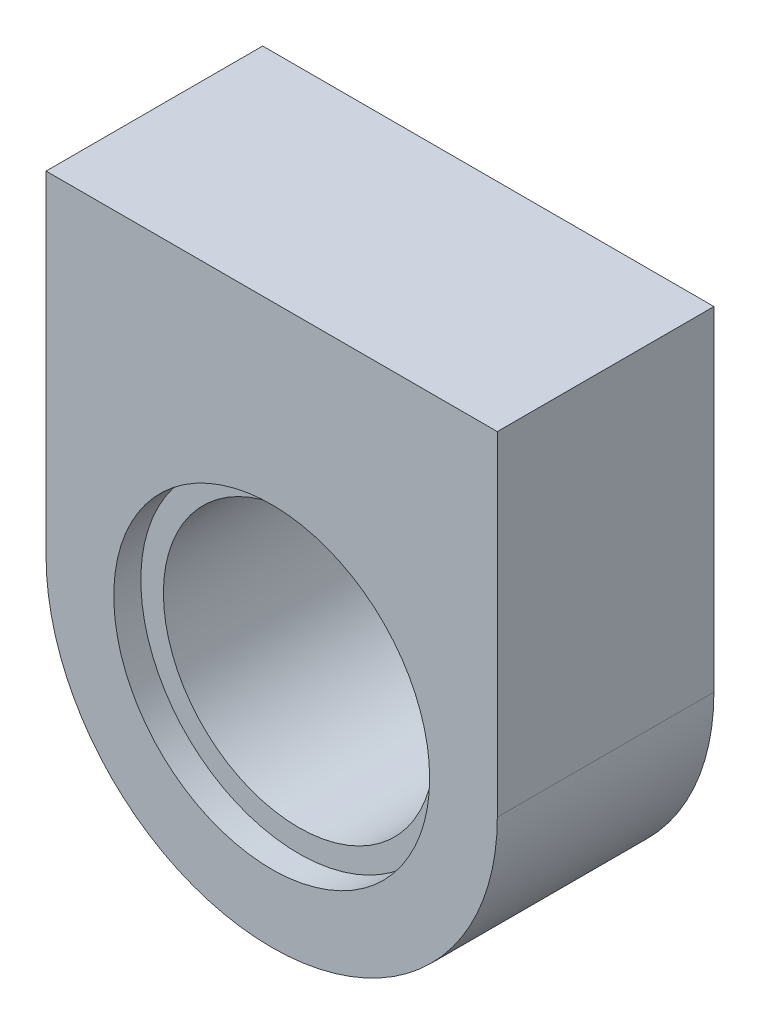
ISO-10303-21;
HEADER;
FILE_DESCRIPTION(('STEP AP214'),'2;1');
FILE_NAME('part.step','',(''),(''),'','','');
FILE_SCHEMA(('AUTOMOTIVE_DESIGN { 1 0 10303 214 1 1 1 1 }'));
ENDSEC;
DATA;
#1=APPLICATION_CONTEXT('core data for automotive mechanical design processes');
#2=APPLICATION_PROTOCOL_DEFINITION('international standard','automotive_design',2000,#1);
#3=PRODUCT_CONTEXT('',#1,'mechanical');
#4=PRODUCT('Part','Part','',(#3));
#5=PRODUCT_RELATED_PRODUCT_CATEGORY('part','',(#4));
#6=PRODUCT_DEFINITION_FORMATION('','',#4);
#7=PRODUCT_DEFINITION_CONTEXT('part definition',#1,'design');
#8=PRODUCT_DEFINITION('design','',#6,#7);
#9=PRODUCT_DEFINITION_SHAPE('','',#8);
#10=(LENGTH_UNIT() NAMED_UNIT(*) SI_UNIT(.MILLI.,.METRE.));
#11=(NAMED_UNIT(*) PLANE_ANGLE_UNIT() SI_UNIT($,.RADIAN.));
#12=(NAMED_UNIT(*) SI_UNIT($,.STERADIAN.) SOLID_ANGLE_UNIT());
#13=UNCERTAINTY_MEASURE_WITH_UNIT(LENGTH_MEASURE(1.E-05),#10,'distance_accuracy_value','');
#14=(GEOMETRIC_REPRESENTATION_CONTEXT(3) GLOBAL_UNCERTAINTY_ASSIGNED_CONTEXT((#13)) GLOBAL_UNIT_ASSIGNED_CONTEXT((#10,
#11,#12)) REPRESENTATION_CONTEXT('',''));
#15=CARTESIAN_POINT('',(0.,0.,0.));
#16=DIRECTION('',(0.,0.,1.));
#17=DIRECTION('',(1.,0.,0.));
#18=AXIS2_PLACEMENT_3D('',#15,#16,#17);
#19=CARTESIAN_POINT('',(25.,-37.,30.));
#20=DIRECTION('',(0.,0.,-1.));
#21=DIRECTION('',(-1.,0.,0.));
#22=AXIS2_PLACEMENT_3D('',#19,#20,#21);
#23=CYLINDRICAL_SURFACE('',#22,15.);
#24=CARTESIAN_POINT('',(25.,-37.,0.));
#25=DIRECTION('',(0.,0.,-1.));
#26=DIRECTION('',(-1.,0.,0.));
#27=AXIS2_PLACEMENT_3D('',#24,#25,#26);
#28=CIRCLE('',#27,15.);
#29=CARTESIAN_POINT('',(10.,-37.,0.));
#30=VERTEX_POINT('',#29);
#31=EDGE_CURVE('E114',#30,#30,#28,.T.);
#32=ORIENTED_EDGE('',*,*,#31,.T.);
#33=EDGE_LOOP('',(#32));
#34=FACE_BOUND('',#33,.T.);
#35=CARTESIAN_POINT('',(25.,-37.,21.));
#36=DIRECTION('',(0.,0.,1.));
#37=DIRECTION('',(1.,0.,0.));
#38=AXIS2_PLACEMENT_3D('',#35,#36,#37);
#39=CIRCLE('',#38,15.);
#40=CARTESIAN_POINT('',(40.,-37.,21.));
#41=VERTEX_POINT('',#40);
#42=EDGE_CURVE('E34',#41,#41,#39,.F.);
#43=ORIENTED_EDGE('',*,*,#42,.F.);
#44=EDGE_LOOP('',(#43));
#45=FACE_BOUND('',#44,.T.);
#46=ADVANCED_FACE('F30',(#34,#45),#23,.F.);
#47=CARTESIAN_POINT('',(0.,0.,24.));
#48=DIRECTION('',(1.,0.,0.));
#49=DIRECTION('',(0.,1.,0.));
#50=AXIS2_PLACEMENT_3D('',#47,#48,#49);
#51=PLANE('',#50);
#52=DIRECTION('',(0.,-1.,0.));
#53=VECTOR('',#52,1.);
#54=CARTESIAN_POINT('',(0.,0.,0.));
#55=LINE('',#54,#53);
#56=CARTESIAN_POINT('',(0.,0.,0.));
#57=VERTEX_POINT('',#56);
#58=CARTESIAN_POINT('',(0.,-37.,0.));
#59=VERTEX_POINT('',#58);
#60=EDGE_CURVE('E99',#57,#59,#55,.T.);
#61=ORIENTED_EDGE('',*,*,#60,.T.);
#62=DIRECTION('',(0.,0.,-1.));
#63=VECTOR('',#62,1.);
#64=CARTESIAN_POINT('',(0.,-37.,24.));
#65=LINE('',#64,#63);
#66=CARTESIAN_POINT('',(0.,-37.,24.));
#67=VERTEX_POINT('',#66);
#68=EDGE_CURVE('E109',#59,#67,#65,.F.);
#69=ORIENTED_EDGE('',*,*,#68,.T.);
#70=DIRECTION('',(0.,-1.,0.));
#71=VECTOR('',#70,1.);
#72=CARTESIAN_POINT('',(0.,0.,24.));
#73=LINE('',#72,#71);
#74=CARTESIAN_POINT('',(0.,0.,24.));
#75=VERTEX_POINT('',#74);
#76=EDGE_CURVE('E80',#75,#67,#73,.T.);
#77=ORIENTED_EDGE('',*,*,#76,.F.);
#78=DIRECTION('',(0.,0.,-1.));
#79=VECTOR('',#78,1.);
#80=CARTESIAN_POINT('',(0.,0.,24.));
#81=LINE('',#80,#79);
#82=EDGE_CURVE('E90',#75,#57,#81,.T.);
#83=ORIENTED_EDGE('',*,*,#82,.T.);
#84=EDGE_LOOP('',(#61,#69,#77,#83));
#85=FACE_BOUND('',#84,.T.);
#86=ADVANCED_FACE('F128',(#85),#51,.F.);
#87=CARTESIAN_POINT('',(50.,0.,24.));
#88=DIRECTION('',(-1.,0.,0.));
#89=DIRECTION('',(0.,-1.,0.));
#90=AXIS2_PLACEMENT_3D('',#87,#88,#89);
#91=PLANE('',#90);
#92=DIRECTION('',(0.,1.,0.));
#93=VECTOR('',#92,1.);
#94=CARTESIAN_POINT('',(50.,0.,24.));
#95=LINE('',#94,#93);
#96=CARTESIAN_POINT('',(50.,-37.,24.));
#97=VERTEX_POINT('',#96);
#98=CARTESIAN_POINT('',(50.,0.,24.));
#99=VERTEX_POINT('',#98);
#100=EDGE_CURVE('E72',#97,#99,#95,.T.);
#101=ORIENTED_EDGE('',*,*,#100,.F.);
#102=DIRECTION('',(0.,0.,-1.));
#103=VECTOR('',#102,1.);
#104=CARTESIAN_POINT('',(50.,-37.,24.));
#105=LINE('',#104,#103);
#106=CARTESIAN_POINT('',(50.,-37.,0.));
#107=VERTEX_POINT('',#106);
#108=EDGE_CURVE('E11',#97,#107,#105,.T.);
#109=ORIENTED_EDGE('',*,*,#108,.T.);
#110=DIRECTION('',(0.,1.,0.));
#111=VECTOR('',#110,1.);
#112=CARTESIAN_POINT('',(50.,0.,0.));
#113=LINE('',#112,#111);
#114=CARTESIAN_POINT('',(50.,0.,0.));
#115=VERTEX_POINT('',#114);
#116=EDGE_CURVE('E86',#107,#115,#113,.T.);
#117=ORIENTED_EDGE('',*,*,#116,.T.);
#118=DIRECTION('',(0.,0.,-1.));
#119=VECTOR('',#118,1.);
#120=CARTESIAN_POINT('',(50.,0.,24.));
#121=LINE('',#120,#119);
#122=EDGE_CURVE('E83',#99,#115,#121,.T.);
#123=ORIENTED_EDGE('',*,*,#122,.F.);
#124=EDGE_LOOP('',(#101,#109,#117,#123));
#125=FACE_BOUND('',#124,.T.);
#126=ADVANCED_FACE('F84',(#125),#91,.F.);
#127=CARTESIAN_POINT('',(0.,0.,24.));
#128=DIRECTION('',(0.,-1.,0.));
#129=DIRECTION('',(0.,0.,-1.));
#130=AXIS2_PLACEMENT_3D('',#127,#128,#129);
#131=PLANE('',#130);
#132=DIRECTION('',(-1.,0.,0.));
#133=VECTOR('',#132,1.);
#134=CARTESIAN_POINT('',(0.,0.,0.));
#135=LINE('',#134,#133);
#136=EDGE_CURVE('E104',#115,#57,#135,.T.);
#137=ORIENTED_EDGE('',*,*,#136,.T.);
#138=ORIENTED_EDGE('',*,*,#82,.F.);
#139=DIRECTION('',(-1.,0.,0.));
#140=VECTOR('',#139,1.);
#141=CARTESIAN_POINT('',(0.,0.,24.));
#142=LINE('',#141,#140);
#143=EDGE_CURVE('E76',#99,#75,#142,.T.);
#144=ORIENTED_EDGE('',*,*,#143,.F.);
#145=ORIENTED_EDGE('',*,*,#122,.T.);
#146=EDGE_LOOP('',(#137,#138,#144,#145));
#147=FACE_BOUND('',#146,.T.);
#148=ADVANCED_FACE('F92',(#147),#131,.F.);
#149=CARTESIAN_POINT('',(0.,-62.,24.));
#150=DIRECTION('',(0.,0.,1.));
#151=DIRECTION('',(1.,0.,0.));
#152=AXIS2_PLACEMENT_3D('',#149,#150,#151);
#153=PLANE('',#152);
#154=CARTESIAN_POINT('',(25.,-37.,24.));
#155=DIRECTION('',(0.,0.,1.));
#156=DIRECTION('',(1.,0.,0.));
#157=AXIS2_PLACEMENT_3D('',#154,#155,#156);
#158=CIRCLE('',#157,17.5);
#159=CARTESIAN_POINT('',(42.5,-37.,24.));
#160=VERTEX_POINT('',#159);
#161=EDGE_CURVE('E125',#160,#160,#158,.T.);
#162=ORIENTED_EDGE('',*,*,#161,.F.);
#163=EDGE_LOOP('',(#162));
#164=FACE_BOUND('',#163,.T.);
#165=ORIENTED_EDGE('',*,*,#76,.T.);
#166=CARTESIAN_POINT('',(25.,-37.,24.));
#167=DIRECTION('',(0.,0.,1.));
#168=DIRECTION('',(1.,0.,0.));
#169=AXIS2_PLACEMENT_3D('',#166,#167,#168);
#170=CIRCLE('',#169,25.);
#171=CARTESIAN_POINT('',(25.,-62.,24.));
#172=VERTEX_POINT('',#171);
#173=EDGE_CURVE('E39',#67,#172,#170,.T.);
#174=ORIENTED_EDGE('',*,*,#173,.T.);
#175=CARTESIAN_POINT('',(25.,-37.,24.));
#176=DIRECTION('',(0.,0.,1.));
#177=DIRECTION('',(1.,0.,0.));
#178=AXIS2_PLACEMENT_3D('',#175,#176,#177);
#179=CIRCLE('',#178,25.);
#180=EDGE_CURVE('E47',#172,#97,#179,.T.);
#181=ORIENTED_EDGE('',*,*,#180,.T.);
#182=ORIENTED_EDGE('',*,*,#100,.T.);
#183=ORIENTED_EDGE('',*,*,#143,.T.);
#184=EDGE_LOOP('',(#165,#174,#181,#182,#183));
#185=FACE_BOUND('',#184,.T.);
#186=ADVANCED_FACE('F74',(#164,#185),#153,.T.);
#187=CARTESIAN_POINT('',(0.,-62.,0.));
#188=DIRECTION('',(0.,0.,1.));
#189=DIRECTION('',(1.,0.,0.));
#190=AXIS2_PLACEMENT_3D('',#187,#188,#189);
#191=PLANE('',#190);
#192=ORIENTED_EDGE('',*,*,#31,.F.);
#193=EDGE_LOOP('',(#192));
#194=FACE_BOUND('',#193,.T.);
#195=CARTESIAN_POINT('',(25.,-37.,0.));
#196=DIRECTION('',(0.,0.,1.));
#197=DIRECTION('',(1.,0.,0.));
#198=AXIS2_PLACEMENT_3D('',#195,#196,#197);
#199=CIRCLE('',#198,25.);
#200=CARTESIAN_POINT('',(25.,-62.,0.));
#201=VERTEX_POINT('',#200);
#202=EDGE_CURVE('E89',#107,#201,#199,.F.);
#203=ORIENTED_EDGE('',*,*,#202,.T.);
#204=CARTESIAN_POINT('',(25.,-37.,0.));
#205=DIRECTION('',(0.,0.,1.));
#206=DIRECTION('',(1.,0.,0.));
#207=AXIS2_PLACEMENT_3D('',#204,#205,#206);
#208=CIRCLE('',#207,25.);
#209=EDGE_CURVE('E107',#201,#59,#208,.F.);
#210=ORIENTED_EDGE('',*,*,#209,.T.);
#211=ORIENTED_EDGE('',*,*,#60,.F.);
#212=ORIENTED_EDGE('',*,*,#136,.F.);
#213=ORIENTED_EDGE('',*,*,#116,.F.);
#214=EDGE_LOOP('',(#203,#210,#211,#212,#213));
#215=FACE_BOUND('',#214,.T.);
#216=ADVANCED_FACE('F133',(#194,#215),#191,.F.);
#217=CARTESIAN_POINT('',(25.,-37.,24.));
#218=DIRECTION('',(0.,0.,-1.));
#219=DIRECTION('',(-1.,0.,0.));
#220=AXIS2_PLACEMENT_3D('',#217,#218,#219);
#221=CYLINDRICAL_SURFACE('',#220,25.);
#222=ORIENTED_EDGE('',*,*,#108,.F.);
#223=ORIENTED_EDGE('',*,*,#180,.F.);
#224=DIRECTION('',(0.,0.,-1.));
#225=VECTOR('',#224,1.);
#226=CARTESIAN_POINT('',(25.,-62.,24.));
#227=LINE('',#226,#225);
#228=EDGE_CURVE('E102',#201,#172,#227,.F.);
#229=ORIENTED_EDGE('',*,*,#228,.F.);
#230=ORIENTED_EDGE('',*,*,#202,.F.);
#231=EDGE_LOOP('',(#222,#223,#229,#230));
#232=FACE_BOUND('',#231,.T.);
#233=ADVANCED_FACE('F32',(#232),#221,.T.);
#234=CARTESIAN_POINT('',(25.,-37.,24.));
#235=DIRECTION('',(0.,0.,-1.));
#236=DIRECTION('',(-1.,0.,0.));
#237=AXIS2_PLACEMENT_3D('',#234,#235,#236);
#238=CYLINDRICAL_SURFACE('',#237,25.);
#239=ORIENTED_EDGE('',*,*,#173,.F.);
#240=ORIENTED_EDGE('',*,*,#68,.F.);
#241=ORIENTED_EDGE('',*,*,#209,.F.);
#242=ORIENTED_EDGE('',*,*,#228,.T.);
#243=EDGE_LOOP('',(#239,#240,#241,#242));
#244=FACE_BOUND('',#243,.T.);
#245=ADVANCED_FACE('F131',(#244),#238,.T.);
#246=CARTESIAN_POINT('',(25.,-37.,21.));
#247=DIRECTION('',(0.,0.,1.));
#248=DIRECTION('',(1.,0.,0.));
#249=AXIS2_PLACEMENT_3D('',#246,#247,#248);
#250=PLANE('',#249);
#251=CARTESIAN_POINT('',(25.,-37.,21.));
#252=DIRECTION('',(0.,0.,1.));
#253=DIRECTION('',(1.,0.,0.));
#254=AXIS2_PLACEMENT_3D('',#251,#252,#253);
#255=CIRCLE('',#254,17.5);
#256=CARTESIAN_POINT('',(42.5,-37.,21.));
#257=VERTEX_POINT('',#256);
#258=EDGE_CURVE('E123',#257,#257,#255,.T.);
#259=ORIENTED_EDGE('',*,*,#258,.T.);
#260=EDGE_LOOP('',(#259));
#261=FACE_BOUND('',#260,.T.);
#262=ORIENTED_EDGE('',*,*,#42,.T.);
#263=EDGE_LOOP('',(#262));
#264=FACE_BOUND('',#263,.T.);
#265=ADVANCED_FACE('F141',(#261,#264),#250,.T.);
#266=CARTESIAN_POINT('',(25.,-37.,21.));
#267=DIRECTION('',(0.,0.,1.));
#268=DIRECTION('',(1.,0.,0.));
#269=AXIS2_PLACEMENT_3D('',#266,#267,#268);
#270=CYLINDRICAL_SURFACE('',#269,17.5);
#271=ORIENTED_EDGE('',*,*,#258,.F.);
#272=EDGE_LOOP('',(#271));
#273=FACE_BOUND('',#272,.T.);
#274=ORIENTED_EDGE('',*,*,#161,.T.);
#275=EDGE_LOOP('',(#274));
#276=FACE_BOUND('',#275,.T.);
#277=ADVANCED_FACE('F153',(#273,#276),#270,.F.);
#278=CLOSED_SHELL('',(#46,#86,#126,#148,#186,#216,#233,#245,#265,#277));
#279=MANIFOLD_SOLID_BREP('B2',#278);
#280=ADVANCED_BREP_SHAPE_REPRESENTATION('',(#18,#279),#14);
#281=SHAPE_DEFINITION_REPRESENTATION(#9,#280);
ENDSEC;
END-ISO-10303-21;
